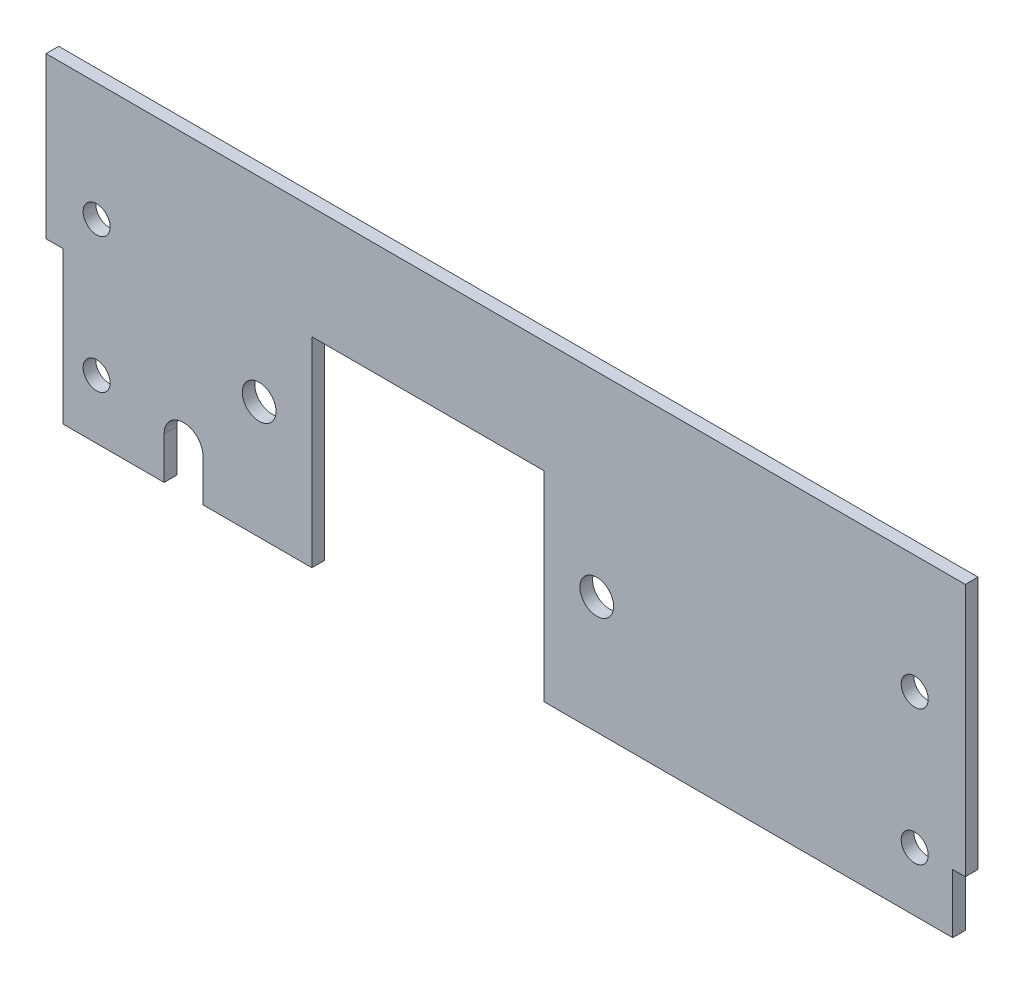
ISO-10303-21;
HEADER;
FILE_DESCRIPTION(('STEP AP214'),'2;1');
FILE_NAME('part.step','',(''),(''),'','','');
FILE_SCHEMA(('AUTOMOTIVE_DESIGN { 1 0 10303 214 1 1 1 1 }'));
ENDSEC;
DATA;
#1=APPLICATION_CONTEXT('core data for automotive mechanical design processes');
#2=APPLICATION_PROTOCOL_DEFINITION('international standard','automotive_design',2000,#1);
#3=PRODUCT_CONTEXT('',#1,'mechanical');
#4=PRODUCT('Part','Part','',(#3));
#5=PRODUCT_RELATED_PRODUCT_CATEGORY('part','',(#4));
#6=PRODUCT_DEFINITION_FORMATION('','',#4);
#7=PRODUCT_DEFINITION_CONTEXT('part definition',#1,'design');
#8=PRODUCT_DEFINITION('design','',#6,#7);
#9=PRODUCT_DEFINITION_SHAPE('','',#8);
#10=(LENGTH_UNIT() NAMED_UNIT(*) SI_UNIT(.MILLI.,.METRE.));
#11=(NAMED_UNIT(*) PLANE_ANGLE_UNIT() SI_UNIT($,.RADIAN.));
#12=(NAMED_UNIT(*) SI_UNIT($,.STERADIAN.) SOLID_ANGLE_UNIT());
#13=UNCERTAINTY_MEASURE_WITH_UNIT(LENGTH_MEASURE(1.E-05),#10,'distance_accuracy_value','');
#14=(GEOMETRIC_REPRESENTATION_CONTEXT(3) GLOBAL_UNCERTAINTY_ASSIGNED_CONTEXT((#13)) GLOBAL_UNIT_ASSIGNED_CONTEXT((#10,
#11,#12)) REPRESENTATION_CONTEXT('',''));
#15=CARTESIAN_POINT('',(0.,0.,0.));
#16=DIRECTION('',(0.,0.,1.));
#17=DIRECTION('',(1.,0.,0.));
#18=AXIS2_PLACEMENT_3D('',#15,#16,#17);
#19=CARTESIAN_POINT('',(110.91474286849,561.080871165908,1.5));
#20=DIRECTION('',(0.,1.,0.));
#21=DIRECTION('',(0.,0.,1.));
#22=AXIS2_PLACEMENT_3D('',#19,#20,#21);
#23=PLANE('',#22);
#24=DIRECTION('',(1.,0.,0.));
#25=VECTOR('',#24,1.);
#26=CARTESIAN_POINT('',(110.91474286849,561.080871165908,0.));
#27=LINE('',#26,#25);
#28=CARTESIAN_POINT('',(3.,561.080871165908,0.));
#29=VERTEX_POINT('',#28);
#30=CARTESIAN_POINT('',(15.,561.080871165908,0.));
#31=VERTEX_POINT('',#30);
#32=EDGE_CURVE('E197',#29,#31,#27,.T.);
#33=ORIENTED_EDGE('',*,*,#32,.T.);
#34=DIRECTION('',(0.,0.,1.));
#35=VECTOR('',#34,1.);
#36=CARTESIAN_POINT('',(15.,561.080871165908,1.5));
#37=LINE('',#36,#35);
#38=CARTESIAN_POINT('',(15.,561.080871165908,1.5));
#39=VERTEX_POINT('',#38);
#40=EDGE_CURVE('E163',#31,#39,#37,.T.);
#41=ORIENTED_EDGE('',*,*,#40,.T.);
#42=DIRECTION('',(1.,0.,0.));
#43=VECTOR('',#42,1.);
#44=CARTESIAN_POINT('',(110.91474286849,561.080871165908,1.5));
#45=LINE('',#44,#43);
#46=CARTESIAN_POINT('',(3.,561.080871165908,1.5));
#47=VERTEX_POINT('',#46);
#48=EDGE_CURVE('E180',#47,#39,#45,.T.);
#49=ORIENTED_EDGE('',*,*,#48,.F.);
#50=DIRECTION('',(0.,0.,1.));
#51=VECTOR('',#50,1.);
#52=CARTESIAN_POINT('',(3.,561.080871165908,0.));
#53=LINE('',#52,#51);
#54=EDGE_CURVE('E273',#29,#47,#53,.T.);
#55=ORIENTED_EDGE('',*,*,#54,.F.);
#56=EDGE_LOOP('',(#33,#41,#49,#55));
#57=FACE_BOUND('',#56,.T.);
#58=ADVANCED_FACE('F39',(#57),#23,.F.);
#59=CARTESIAN_POINT('',(19.6,561.080871165908,1.5));
#60=VERTEX_POINT('',#59);
#61=CARTESIAN_POINT('',(32.5,561.080871165908,1.5));
#62=VERTEX_POINT('',#61);
#63=EDGE_CURVE('E172',#60,#62,#45,.T.);
#64=ORIENTED_EDGE('',*,*,#63,.F.);
#65=DIRECTION('',(0.,0.,-1.));
#66=VECTOR('',#65,1.);
#67=CARTESIAN_POINT('',(19.6,561.080871165908,1.5));
#68=LINE('',#67,#66);
#69=CARTESIAN_POINT('',(19.6,561.080871165908,0.));
#70=VERTEX_POINT('',#69);
#71=EDGE_CURVE('E153',#60,#70,#68,.T.);
#72=ORIENTED_EDGE('',*,*,#71,.T.);
#73=CARTESIAN_POINT('',(32.5,561.080871165908,0.));
#74=VERTEX_POINT('',#73);
#75=EDGE_CURVE('E201',#70,#74,#27,.T.);
#76=ORIENTED_EDGE('',*,*,#75,.T.);
#77=DIRECTION('',(0.,0.,1.));
#78=VECTOR('',#77,1.);
#79=CARTESIAN_POINT('',(32.5,561.080871165908,1.5));
#80=LINE('',#79,#78);
#81=EDGE_CURVE('E164',#74,#62,#80,.T.);
#82=ORIENTED_EDGE('',*,*,#81,.T.);
#83=EDGE_LOOP('',(#64,#72,#76,#82));
#84=FACE_BOUND('',#83,.T.);
#85=ADVANCED_FACE('F178',(#84),#23,.F.);
#86=CARTESIAN_POINT('',(0.,0.,1.5));
#87=DIRECTION('',(0.,0.,1.));
#88=DIRECTION('',(1.,0.,0.));
#89=AXIS2_PLACEMENT_3D('',#86,#87,#88);
#90=PLANE('',#89);
#91=DIRECTION('',(0.,-1.,0.));
#92=VECTOR('',#91,1.);
#93=CARTESIAN_POINT('',(15.,561.080871165908,1.5));
#94=LINE('',#93,#92);
#95=CARTESIAN_POINT('',(15.,566.080871165908,1.5));
#96=VERTEX_POINT('',#95);
#97=EDGE_CURVE('E404',#96,#39,#94,.T.);
#98=ORIENTED_EDGE('',*,*,#97,.F.);
#99=CARTESIAN_POINT('',(17.3,566.080871165908,1.5));
#100=DIRECTION('',(0.,0.,1.));
#101=DIRECTION('',(1.,0.,0.));
#102=AXIS2_PLACEMENT_3D('',#99,#100,#101);
#103=CIRCLE('',#102,2.3);
#104=CARTESIAN_POINT('',(19.6,566.080871165908,1.5));
#105=VERTEX_POINT('',#104);
#106=EDGE_CURVE('E174',#105,#96,#103,.T.);
#107=ORIENTED_EDGE('',*,*,#106,.F.);
#108=DIRECTION('',(0.,1.,0.));
#109=VECTOR('',#108,1.);
#110=CARTESIAN_POINT('',(19.6,561.080871165908,1.5));
#111=LINE('',#110,#109);
#112=EDGE_CURVE('E156',#60,#105,#111,.T.);
#113=ORIENTED_EDGE('',*,*,#112,.F.);
#114=ORIENTED_EDGE('',*,*,#63,.T.);
#115=DIRECTION('',(0.,-1.,0.));
#116=VECTOR('',#115,1.);
#117=CARTESIAN_POINT('',(32.5,584.780871165908,1.5));
#118=LINE('',#117,#116);
#119=CARTESIAN_POINT('',(32.5,584.780871165908,1.5));
#120=VERTEX_POINT('',#119);
#121=EDGE_CURVE('E426',#120,#62,#118,.T.);
#122=ORIENTED_EDGE('',*,*,#121,.F.);
#123=DIRECTION('',(-1.,0.,0.));
#124=VECTOR('',#123,1.);
#125=CARTESIAN_POINT('',(32.5,584.780871165908,1.5));
#126=LINE('',#125,#124);
#127=CARTESIAN_POINT('',(60.,584.780871165908,1.5));
#128=VERTEX_POINT('',#127);
#129=EDGE_CURVE('E418',#128,#120,#126,.T.);
#130=ORIENTED_EDGE('',*,*,#129,.F.);
#131=DIRECTION('',(0.,1.,0.));
#132=VECTOR('',#131,1.);
#133=CARTESIAN_POINT('',(60.,584.780871165908,1.5));
#134=LINE('',#133,#132);
#135=CARTESIAN_POINT('',(60.,561.080871165908,1.5));
#136=VERTEX_POINT('',#135);
#137=EDGE_CURVE('E359',#136,#128,#134,.T.);
#138=ORIENTED_EDGE('',*,*,#137,.F.);
#139=CARTESIAN_POINT('',(108.41474286849,561.080871165908,1.5));
#140=VERTEX_POINT('',#139);
#141=EDGE_CURVE('E181',#136,#140,#45,.T.);
#142=ORIENTED_EDGE('',*,*,#141,.T.);
#143=DIRECTION('',(0.,1.,0.));
#144=VECTOR('',#143,1.);
#145=CARTESIAN_POINT('',(108.41474286849,0.,1.5));
#146=LINE('',#145,#144);
#147=CARTESIAN_POINT('',(108.41474286849,568.080871165908,1.5));
#148=VERTEX_POINT('',#147);
#149=EDGE_CURVE('E246',#140,#148,#146,.T.);
#150=ORIENTED_EDGE('',*,*,#149,.T.);
#151=DIRECTION('',(-1.,0.,0.));
#152=VECTOR('',#151,1.);
#153=CARTESIAN_POINT('',(0.,568.080871165908,1.5));
#154=LINE('',#153,#152);
#155=CARTESIAN_POINT('',(109.91474286849,568.080871165908,1.5));
#156=VERTEX_POINT('',#155);
#157=EDGE_CURVE('E370',#156,#148,#154,.T.);
#158=ORIENTED_EDGE('',*,*,#157,.F.);
#159=DIRECTION('',(0.,-1.,0.));
#160=VECTOR('',#159,1.);
#161=CARTESIAN_POINT('',(109.91474286849,0.,1.5));
#162=LINE('',#161,#160);
#163=CARTESIAN_POINT('',(109.91474286849,598.080871165908,1.5));
#164=VERTEX_POINT('',#163);
#165=EDGE_CURVE('E366',#164,#156,#162,.T.);
#166=ORIENTED_EDGE('',*,*,#165,.F.);
#167=DIRECTION('',(-1.,0.,0.));
#168=VECTOR('',#167,1.);
#169=CARTESIAN_POINT('',(110.91474286849,598.080871165908,1.5));
#170=LINE('',#169,#168);
#171=CARTESIAN_POINT('',(1.,598.080871165908,1.5));
#172=VERTEX_POINT('',#171);
#173=EDGE_CURVE('E187',#164,#172,#170,.T.);
#174=ORIENTED_EDGE('',*,*,#173,.T.);
#175=DIRECTION('',(0.,-1.,0.));
#176=VECTOR('',#175,1.);
#177=CARTESIAN_POINT('',(1.00000000000007,0.,1.5));
#178=LINE('',#177,#176);
#179=CARTESIAN_POINT('',(1.,579.080871165908,1.5));
#180=VERTEX_POINT('',#179);
#181=EDGE_CURVE('E234',#172,#180,#178,.T.);
#182=ORIENTED_EDGE('',*,*,#181,.T.);
#183=DIRECTION('',(-1.,0.,0.));
#184=VECTOR('',#183,1.);
#185=CARTESIAN_POINT('',(0.,579.080871165908,1.5));
#186=LINE('',#185,#184);
#187=CARTESIAN_POINT('',(3.,579.080871165908,1.5));
#188=VERTEX_POINT('',#187);
#189=EDGE_CURVE('E269',#188,#180,#186,.T.);
#190=ORIENTED_EDGE('',*,*,#189,.F.);
#191=DIRECTION('',(0.,1.,0.));
#192=VECTOR('',#191,1.);
#193=CARTESIAN_POINT('',(3.,561.080871165908,1.5));
#194=LINE('',#193,#192);
#195=EDGE_CURVE('E263',#47,#188,#194,.T.);
#196=ORIENTED_EDGE('',*,*,#195,.F.);
#197=ORIENTED_EDGE('',*,*,#48,.T.);
#198=EDGE_LOOP('',(#98,#107,#113,#114,#122,#130,#138,#142,#150,#158,#166,#174,#182,#190,#196,#197));
#199=FACE_BOUND('',#198,.T.);
#200=CARTESIAN_POINT('',(26.25,574.980871165908,1.5));
#201=DIRECTION('',(0.,0.,1.));
#202=DIRECTION('',(1.,0.,0.));
#203=AXIS2_PLACEMENT_3D('',#200,#201,#202);
#204=CIRCLE('',#203,2.);
#205=CARTESIAN_POINT('',(28.25,574.980871165908,1.5));
#206=VERTEX_POINT('',#205);
#207=EDGE_CURVE('E436',#206,#206,#204,.T.);
#208=ORIENTED_EDGE('',*,*,#207,.F.);
#209=EDGE_LOOP('',(#208));
#210=FACE_BOUND('',#209,.T.);
#211=CARTESIAN_POINT('',(66.25,574.980871165908,1.5));
#212=DIRECTION('',(0.,0.,1.));
#213=DIRECTION('',(1.,0.,0.));
#214=AXIS2_PLACEMENT_3D('',#211,#212,#213);
#215=CIRCLE('',#214,2.);
#216=CARTESIAN_POINT('',(68.25,574.980871165908,1.5));
#217=VERTEX_POINT('',#216);
#218=EDGE_CURVE('E429',#217,#217,#215,.T.);
#219=ORIENTED_EDGE('',*,*,#218,.F.);
#220=EDGE_LOOP('',(#219));
#221=FACE_BOUND('',#220,.T.);
#222=CARTESIAN_POINT('',(7.,584.080871165908,1.5));
#223=DIRECTION('',(0.,0.,1.));
#224=DIRECTION('',(1.,0.,0.));
#225=AXIS2_PLACEMENT_3D('',#222,#223,#224);
#226=CIRCLE('',#225,1.60000000000006);
#227=CARTESIAN_POINT('',(8.60000000000005,584.080871165908,1.5));
#228=VERTEX_POINT('',#227);
#229=EDGE_CURVE('E293',#228,#228,#226,.T.);
#230=ORIENTED_EDGE('',*,*,#229,.F.);
#231=EDGE_LOOP('',(#230));
#232=FACE_BOUND('',#231,.T.);
#233=CARTESIAN_POINT('',(103.91474286849,584.080871165908,1.5));
#234=DIRECTION('',(0.,0.,1.));
#235=DIRECTION('',(1.,0.,0.));
#236=AXIS2_PLACEMENT_3D('',#233,#234,#235);
#237=CIRCLE('',#236,1.60000000000008);
#238=CARTESIAN_POINT('',(105.51474286849,584.080871165908,1.5));
#239=VERTEX_POINT('',#238);
#240=EDGE_CURVE('E196',#239,#239,#237,.T.);
#241=ORIENTED_EDGE('',*,*,#240,.F.);
#242=EDGE_LOOP('',(#241));
#243=FACE_BOUND('',#242,.T.);
#244=CARTESIAN_POINT('',(103.91474286849,568.080871165908,1.5));
#245=DIRECTION('',(0.,0.,1.));
#246=DIRECTION('',(1.,0.,0.));
#247=AXIS2_PLACEMENT_3D('',#244,#245,#246);
#248=CIRCLE('',#247,1.60000000000008);
#249=CARTESIAN_POINT('',(105.51474286849,568.080871165908,1.5));
#250=VERTEX_POINT('',#249);
#251=EDGE_CURVE('E301',#250,#250,#248,.T.);
#252=ORIENTED_EDGE('',*,*,#251,.F.);
#253=EDGE_LOOP('',(#252));
#254=FACE_BOUND('',#253,.T.);
#255=CARTESIAN_POINT('',(7.,568.080871165908,1.5));
#256=DIRECTION('',(0.,0.,1.));
#257=DIRECTION('',(1.,0.,0.));
#258=AXIS2_PLACEMENT_3D('',#255,#256,#257);
#259=CIRCLE('',#258,1.60000000000006);
#260=CARTESIAN_POINT('',(8.60000000000005,568.080871165908,1.5));
#261=VERTEX_POINT('',#260);
#262=EDGE_CURVE('E285',#261,#261,#259,.T.);
#263=ORIENTED_EDGE('',*,*,#262,.F.);
#264=EDGE_LOOP('',(#263));
#265=FACE_BOUND('',#264,.T.);
#266=ADVANCED_FACE('F169',(#199,#210,#221,#232,#243,#254,#265),#90,.T.);
#267=CARTESIAN_POINT('',(0.,0.,0.));
#268=DIRECTION('',(0.,0.,1.));
#269=DIRECTION('',(1.,0.,0.));
#270=AXIS2_PLACEMENT_3D('',#267,#268,#269);
#271=PLANE('',#270);
#272=CARTESIAN_POINT('',(26.25,574.980871165908,0.));
#273=DIRECTION('',(0.,0.,1.));
#274=DIRECTION('',(1.,0.,0.));
#275=AXIS2_PLACEMENT_3D('',#272,#273,#274);
#276=CIRCLE('',#275,2.);
#277=CARTESIAN_POINT('',(28.25,574.980871165908,0.));
#278=VERTEX_POINT('',#277);
#279=EDGE_CURVE('E230',#278,#278,#276,.T.);
#280=ORIENTED_EDGE('',*,*,#279,.T.);
#281=EDGE_LOOP('',(#280));
#282=FACE_BOUND('',#281,.T.);
#283=CARTESIAN_POINT('',(66.25,574.980871165908,0.));
#284=DIRECTION('',(0.,0.,1.));
#285=DIRECTION('',(1.,0.,0.));
#286=AXIS2_PLACEMENT_3D('',#283,#284,#285);
#287=CIRCLE('',#286,2.);
#288=CARTESIAN_POINT('',(68.25,574.980871165908,0.));
#289=VERTEX_POINT('',#288);
#290=EDGE_CURVE('E227',#289,#289,#287,.T.);
#291=ORIENTED_EDGE('',*,*,#290,.T.);
#292=EDGE_LOOP('',(#291));
#293=FACE_BOUND('',#292,.T.);
#294=CARTESIAN_POINT('',(103.91474286849,584.080871165908,0.));
#295=DIRECTION('',(0.,0.,1.));
#296=DIRECTION('',(1.,0.,0.));
#297=AXIS2_PLACEMENT_3D('',#294,#295,#296);
#298=CIRCLE('',#297,1.60000000000008);
#299=CARTESIAN_POINT('',(105.51474286849,584.080871165908,0.));
#300=VERTEX_POINT('',#299);
#301=EDGE_CURVE('E305',#300,#300,#298,.T.);
#302=ORIENTED_EDGE('',*,*,#301,.T.);
#303=EDGE_LOOP('',(#302));
#304=FACE_BOUND('',#303,.T.);
#305=CARTESIAN_POINT('',(103.91474286849,568.080871165908,0.));
#306=DIRECTION('',(0.,0.,1.));
#307=DIRECTION('',(1.,0.,0.));
#308=AXIS2_PLACEMENT_3D('',#305,#306,#307);
#309=CIRCLE('',#308,1.60000000000008);
#310=CARTESIAN_POINT('',(105.51474286849,568.080871165908,0.));
#311=VERTEX_POINT('',#310);
#312=EDGE_CURVE('E297',#311,#311,#309,.T.);
#313=ORIENTED_EDGE('',*,*,#312,.T.);
#314=EDGE_LOOP('',(#313));
#315=FACE_BOUND('',#314,.T.);
#316=CARTESIAN_POINT('',(7.,584.080871165908,0.));
#317=DIRECTION('',(0.,0.,1.));
#318=DIRECTION('',(1.,0.,0.));
#319=AXIS2_PLACEMENT_3D('',#316,#317,#318);
#320=CIRCLE('',#319,1.60000000000006);
#321=CARTESIAN_POINT('',(8.60000000000005,584.080871165908,0.));
#322=VERTEX_POINT('',#321);
#323=EDGE_CURVE('E289',#322,#322,#320,.T.);
#324=ORIENTED_EDGE('',*,*,#323,.T.);
#325=EDGE_LOOP('',(#324));
#326=FACE_BOUND('',#325,.T.);
#327=CARTESIAN_POINT('',(7.,568.080871165908,0.));
#328=DIRECTION('',(0.,0.,1.));
#329=DIRECTION('',(1.,0.,0.));
#330=AXIS2_PLACEMENT_3D('',#327,#328,#329);
#331=CIRCLE('',#330,1.60000000000006);
#332=CARTESIAN_POINT('',(8.60000000000005,568.080871165908,0.));
#333=VERTEX_POINT('',#332);
#334=EDGE_CURVE('E282',#333,#333,#331,.T.);
#335=ORIENTED_EDGE('',*,*,#334,.T.);
#336=EDGE_LOOP('',(#335));
#337=FACE_BOUND('',#336,.T.);
#338=CARTESIAN_POINT('',(17.3,566.080871165908,0.));
#339=DIRECTION('',(0.,0.,1.));
#340=DIRECTION('',(1.,0.,0.));
#341=AXIS2_PLACEMENT_3D('',#338,#339,#340);
#342=CIRCLE('',#341,2.3);
#343=CARTESIAN_POINT('',(19.6,566.080871165908,0.));
#344=VERTEX_POINT('',#343);
#345=CARTESIAN_POINT('',(15.,566.080871165908,0.));
#346=VERTEX_POINT('',#345);
#347=EDGE_CURVE('E11',#344,#346,#342,.T.);
#348=ORIENTED_EDGE('',*,*,#347,.T.);
#349=DIRECTION('',(0.,-1.,0.));
#350=VECTOR('',#349,1.);
#351=CARTESIAN_POINT('',(15.,0.,0.));
#352=LINE('',#351,#350);
#353=EDGE_CURVE('E231',#346,#31,#352,.T.);
#354=ORIENTED_EDGE('',*,*,#353,.T.);
#355=ORIENTED_EDGE('',*,*,#32,.F.);
#356=DIRECTION('',(0.,1.,0.));
#357=VECTOR('',#356,1.);
#358=CARTESIAN_POINT('',(3.,561.080871165908,0.));
#359=LINE('',#358,#357);
#360=CARTESIAN_POINT('',(3.,579.080871165908,0.));
#361=VERTEX_POINT('',#360);
#362=EDGE_CURVE('E264',#29,#361,#359,.T.);
#363=ORIENTED_EDGE('',*,*,#362,.T.);
#364=DIRECTION('',(-1.,0.,0.));
#365=VECTOR('',#364,1.);
#366=CARTESIAN_POINT('',(0.,579.080871165908,0.));
#367=LINE('',#366,#365);
#368=CARTESIAN_POINT('',(1.,579.080871165908,0.));
#369=VERTEX_POINT('',#368);
#370=EDGE_CURVE('E268',#361,#369,#367,.T.);
#371=ORIENTED_EDGE('',*,*,#370,.T.);
#372=DIRECTION('',(0.,-1.,0.));
#373=VECTOR('',#372,1.);
#374=CARTESIAN_POINT('',(1.00000000000007,0.,0.));
#375=LINE('',#374,#373);
#376=CARTESIAN_POINT('',(1.,598.080871165908,0.));
#377=VERTEX_POINT('',#376);
#378=EDGE_CURVE('E252',#377,#369,#375,.T.);
#379=ORIENTED_EDGE('',*,*,#378,.F.);
#380=DIRECTION('',(-1.,0.,0.));
#381=VECTOR('',#380,1.);
#382=CARTESIAN_POINT('',(110.91474286849,598.080871165908,0.));
#383=LINE('',#382,#381);
#384=CARTESIAN_POINT('',(109.91474286849,598.080871165908,0.));
#385=VERTEX_POINT('',#384);
#386=EDGE_CURVE('E191',#385,#377,#383,.T.);
#387=ORIENTED_EDGE('',*,*,#386,.F.);
#388=DIRECTION('',(0.,-1.,0.));
#389=VECTOR('',#388,1.);
#390=CARTESIAN_POINT('',(109.91474286849,0.,0.));
#391=LINE('',#390,#389);
#392=CARTESIAN_POINT('',(109.91474286849,568.080871165908,0.));
#393=VERTEX_POINT('',#392);
#394=EDGE_CURVE('E259',#385,#393,#391,.T.);
#395=ORIENTED_EDGE('',*,*,#394,.T.);
#396=DIRECTION('',(-1.,0.,0.));
#397=VECTOR('',#396,1.);
#398=CARTESIAN_POINT('',(0.,568.080871165908,0.));
#399=LINE('',#398,#397);
#400=CARTESIAN_POINT('',(108.41474286849,568.080871165908,0.));
#401=VERTEX_POINT('',#400);
#402=EDGE_CURVE('E212',#393,#401,#399,.T.);
#403=ORIENTED_EDGE('',*,*,#402,.T.);
#404=DIRECTION('',(0.,1.,0.));
#405=VECTOR('',#404,1.);
#406=CARTESIAN_POINT('',(108.41474286849,0.,0.));
#407=LINE('',#406,#405);
#408=CARTESIAN_POINT('',(108.41474286849,561.080871165908,0.));
#409=VERTEX_POINT('',#408);
#410=EDGE_CURVE('E255',#409,#401,#407,.T.);
#411=ORIENTED_EDGE('',*,*,#410,.F.);
#412=CARTESIAN_POINT('',(60.,561.080871165908,0.));
#413=VERTEX_POINT('',#412);
#414=EDGE_CURVE('E195',#413,#409,#27,.T.);
#415=ORIENTED_EDGE('',*,*,#414,.F.);
#416=DIRECTION('',(0.,1.,0.));
#417=VECTOR('',#416,1.);
#418=CARTESIAN_POINT('',(60.,0.,0.));
#419=LINE('',#418,#417);
#420=CARTESIAN_POINT('',(60.,584.780871165908,0.));
#421=VERTEX_POINT('',#420);
#422=EDGE_CURVE('E55',#413,#421,#419,.T.);
#423=ORIENTED_EDGE('',*,*,#422,.T.);
#424=DIRECTION('',(-1.,0.,0.));
#425=VECTOR('',#424,1.);
#426=CARTESIAN_POINT('',(0.,584.780871165908,0.));
#427=LINE('',#426,#425);
#428=CARTESIAN_POINT('',(32.5,584.780871165908,0.));
#429=VERTEX_POINT('',#428);
#430=EDGE_CURVE('E48',#421,#429,#427,.T.);
#431=ORIENTED_EDGE('',*,*,#430,.T.);
#432=DIRECTION('',(0.,-1.,0.));
#433=VECTOR('',#432,1.);
#434=CARTESIAN_POINT('',(32.5,0.,0.));
#435=LINE('',#434,#433);
#436=EDGE_CURVE('E407',#429,#74,#435,.T.);
#437=ORIENTED_EDGE('',*,*,#436,.T.);
#438=ORIENTED_EDGE('',*,*,#75,.F.);
#439=DIRECTION('',(0.,1.,0.));
#440=VECTOR('',#439,1.);
#441=CARTESIAN_POINT('',(19.6,0.,0.));
#442=LINE('',#441,#440);
#443=EDGE_CURVE('E63',#70,#344,#442,.T.);
#444=ORIENTED_EDGE('',*,*,#443,.T.);
#445=EDGE_LOOP('',(#348,#354,#355,#363,#371,#379,#387,#395,#403,#411,#415,#423,#431,#437,#438,#444));
#446=FACE_BOUND('',#445,.T.);
#447=ADVANCED_FACE('F315',(#282,#293,#304,#315,#326,#337,#446),#271,.F.);
#448=CARTESIAN_POINT('',(110.91474286849,598.080871165908,1.5));
#449=DIRECTION('',(0.,-1.,0.));
#450=DIRECTION('',(0.,0.,-1.));
#451=AXIS2_PLACEMENT_3D('',#448,#449,#450);
#452=PLANE('',#451);
#453=ORIENTED_EDGE('',*,*,#173,.F.);
#454=DIRECTION('',(0.,0.,-1.));
#455=VECTOR('',#454,1.);
#456=CARTESIAN_POINT('',(109.91474286849,598.080871165908,1.5));
#457=LINE('',#456,#455);
#458=EDGE_CURVE('E208',#164,#385,#457,.T.);
#459=ORIENTED_EDGE('',*,*,#458,.T.);
#460=ORIENTED_EDGE('',*,*,#386,.T.);
#461=DIRECTION('',(0.,0.,1.));
#462=VECTOR('',#461,1.);
#463=CARTESIAN_POINT('',(1.,598.080871165908,-8.5));
#464=LINE('',#463,#462);
#465=EDGE_CURVE('E239',#377,#172,#464,.T.);
#466=ORIENTED_EDGE('',*,*,#465,.T.);
#467=EDGE_LOOP('',(#453,#459,#460,#466));
#468=FACE_BOUND('',#467,.T.);
#469=ADVANCED_FACE('F41',(#468),#452,.F.);
#470=ORIENTED_EDGE('',*,*,#141,.F.);
#471=DIRECTION('',(0.,0.,-1.));
#472=VECTOR('',#471,1.);
#473=CARTESIAN_POINT('',(60.,561.080871165908,1.5));
#474=LINE('',#473,#472);
#475=EDGE_CURVE('E216',#136,#413,#474,.T.);
#476=ORIENTED_EDGE('',*,*,#475,.T.);
#477=ORIENTED_EDGE('',*,*,#414,.T.);
#478=DIRECTION('',(0.,0.,-1.));
#479=VECTOR('',#478,1.);
#480=CARTESIAN_POINT('',(108.41474286849,561.080871165908,1.5));
#481=LINE('',#480,#479);
#482=EDGE_CURVE('E204',#140,#409,#481,.T.);
#483=ORIENTED_EDGE('',*,*,#482,.F.);
#484=EDGE_LOOP('',(#470,#476,#477,#483));
#485=FACE_BOUND('',#484,.T.);
#486=ADVANCED_FACE('F331',(#485),#23,.F.);
#487=CARTESIAN_POINT('',(0.,579.080871165908,0.));
#488=DIRECTION('',(0.,1.,0.));
#489=DIRECTION('',(0.,0.,1.));
#490=AXIS2_PLACEMENT_3D('',#487,#488,#489);
#491=PLANE('',#490);
#492=DIRECTION('',(0.,0.,1.));
#493=VECTOR('',#492,1.);
#494=CARTESIAN_POINT('',(1.,579.080871165908,0.));
#495=LINE('',#494,#493);
#496=EDGE_CURVE('E186',#369,#180,#495,.T.);
#497=ORIENTED_EDGE('',*,*,#496,.F.);
#498=ORIENTED_EDGE('',*,*,#370,.F.);
#499=DIRECTION('',(0.,0.,1.));
#500=VECTOR('',#499,1.);
#501=CARTESIAN_POINT('',(3.,579.080871165908,0.));
#502=LINE('',#501,#500);
#503=EDGE_CURVE('E279',#361,#188,#502,.T.);
#504=ORIENTED_EDGE('',*,*,#503,.T.);
#505=ORIENTED_EDGE('',*,*,#189,.T.);
#506=EDGE_LOOP('',(#497,#498,#504,#505));
#507=FACE_BOUND('',#506,.T.);
#508=ADVANCED_FACE('F321',(#507),#491,.F.);
#509=CARTESIAN_POINT('',(103.91474286849,584.080871165908,1.5));
#510=DIRECTION('',(0.,0.,-1.));
#511=DIRECTION('',(-1.,0.,0.));
#512=AXIS2_PLACEMENT_3D('',#509,#510,#511);
#513=CYLINDRICAL_SURFACE('',#512,1.60000000000008);
#514=ORIENTED_EDGE('',*,*,#240,.T.);
#515=EDGE_LOOP('',(#514));
#516=FACE_BOUND('',#515,.T.);
#517=ORIENTED_EDGE('',*,*,#301,.F.);
#518=EDGE_LOOP('',(#517));
#519=FACE_BOUND('',#518,.T.);
#520=ADVANCED_FACE('F318',(#516,#519),#513,.F.);
#521=CARTESIAN_POINT('',(103.91474286849,568.080871165908,1.5));
#522=DIRECTION('',(0.,0.,-1.));
#523=DIRECTION('',(-1.,0.,0.));
#524=AXIS2_PLACEMENT_3D('',#521,#522,#523);
#525=CYLINDRICAL_SURFACE('',#524,1.60000000000008);
#526=ORIENTED_EDGE('',*,*,#251,.T.);
#527=EDGE_LOOP('',(#526));
#528=FACE_BOUND('',#527,.T.);
#529=ORIENTED_EDGE('',*,*,#312,.F.);
#530=EDGE_LOOP('',(#529));
#531=FACE_BOUND('',#530,.T.);
#532=ADVANCED_FACE('F320',(#528,#531),#525,.F.);
#533=CARTESIAN_POINT('',(7.,584.080871165908,1.5));
#534=DIRECTION('',(0.,0.,-1.));
#535=DIRECTION('',(-1.,0.,0.));
#536=AXIS2_PLACEMENT_3D('',#533,#534,#535);
#537=CYLINDRICAL_SURFACE('',#536,1.60000000000006);
#538=ORIENTED_EDGE('',*,*,#229,.T.);
#539=EDGE_LOOP('',(#538));
#540=FACE_BOUND('',#539,.T.);
#541=ORIENTED_EDGE('',*,*,#323,.F.);
#542=EDGE_LOOP('',(#541));
#543=FACE_BOUND('',#542,.T.);
#544=ADVANCED_FACE('F327',(#540,#543),#537,.F.);
#545=CARTESIAN_POINT('',(7.,568.080871165908,1.5));
#546=DIRECTION('',(0.,0.,-1.));
#547=DIRECTION('',(-1.,0.,0.));
#548=AXIS2_PLACEMENT_3D('',#545,#546,#547);
#549=CYLINDRICAL_SURFACE('',#548,1.60000000000006);
#550=ORIENTED_EDGE('',*,*,#262,.T.);
#551=EDGE_LOOP('',(#550));
#552=FACE_BOUND('',#551,.T.);
#553=ORIENTED_EDGE('',*,*,#334,.F.);
#554=EDGE_LOOP('',(#553));
#555=FACE_BOUND('',#554,.T.);
#556=ADVANCED_FACE('F461',(#552,#555),#549,.F.);
#557=CARTESIAN_POINT('',(3.,561.080871165908,0.));
#558=DIRECTION('',(1.,0.,0.));
#559=DIRECTION('',(0.,0.,-1.));
#560=AXIS2_PLACEMENT_3D('',#557,#558,#559);
#561=PLANE('',#560);
#562=ORIENTED_EDGE('',*,*,#195,.T.);
#563=ORIENTED_EDGE('',*,*,#503,.F.);
#564=ORIENTED_EDGE('',*,*,#362,.F.);
#565=ORIENTED_EDGE('',*,*,#54,.T.);
#566=EDGE_LOOP('',(#562,#563,#564,#565));
#567=FACE_BOUND('',#566,.T.);
#568=ADVANCED_FACE('F464',(#567),#561,.F.);
#569=CARTESIAN_POINT('',(1.00000000000007,0.,-8.5));
#570=DIRECTION('',(-1.,0.,0.));
#571=DIRECTION('',(0.,-1.,0.));
#572=AXIS2_PLACEMENT_3D('',#569,#570,#571);
#573=PLANE('',#572);
#574=ORIENTED_EDGE('',*,*,#378,.T.);
#575=ORIENTED_EDGE('',*,*,#496,.T.);
#576=ORIENTED_EDGE('',*,*,#181,.F.);
#577=ORIENTED_EDGE('',*,*,#465,.F.);
#578=EDGE_LOOP('',(#574,#575,#576,#577));
#579=FACE_BOUND('',#578,.T.);
#580=ADVANCED_FACE('F394',(#579),#573,.T.);
#581=CARTESIAN_POINT('',(0.,568.080871165908,-8.5));
#582=DIRECTION('',(0.,1.,0.));
#583=DIRECTION('',(0.,0.,1.));
#584=AXIS2_PLACEMENT_3D('',#581,#582,#583);
#585=PLANE('',#584);
#586=DIRECTION('',(0.,0.,1.));
#587=VECTOR('',#586,1.);
#588=CARTESIAN_POINT('',(109.91474286849,568.080871165908,-8.5));
#589=LINE('',#588,#587);
#590=EDGE_CURVE('E249',#393,#156,#589,.T.);
#591=ORIENTED_EDGE('',*,*,#590,.T.);
#592=ORIENTED_EDGE('',*,*,#157,.T.);
#593=DIRECTION('',(0.,0.,1.));
#594=VECTOR('',#593,1.);
#595=CARTESIAN_POINT('',(108.41474286849,568.080871165908,-8.5));
#596=LINE('',#595,#594);
#597=EDGE_CURVE('E256',#401,#148,#596,.T.);
#598=ORIENTED_EDGE('',*,*,#597,.F.);
#599=ORIENTED_EDGE('',*,*,#402,.F.);
#600=EDGE_LOOP('',(#591,#592,#598,#599));
#601=FACE_BOUND('',#600,.T.);
#602=ADVANCED_FACE('F380',(#601),#585,.F.);
#603=CARTESIAN_POINT('',(109.91474286849,0.,-8.5));
#604=DIRECTION('',(-1.,0.,0.));
#605=DIRECTION('',(0.,0.,1.));
#606=AXIS2_PLACEMENT_3D('',#603,#604,#605);
#607=PLANE('',#606);
#608=ORIENTED_EDGE('',*,*,#458,.F.);
#609=ORIENTED_EDGE('',*,*,#165,.T.);
#610=ORIENTED_EDGE('',*,*,#590,.F.);
#611=ORIENTED_EDGE('',*,*,#394,.F.);
#612=EDGE_LOOP('',(#608,#609,#610,#611));
#613=FACE_BOUND('',#612,.T.);
#614=ADVANCED_FACE('F383',(#613),#607,.F.);
#615=CARTESIAN_POINT('',(108.41474286849,0.,-8.5));
#616=DIRECTION('',(1.,0.,0.));
#617=DIRECTION('',(0.,0.,-1.));
#618=AXIS2_PLACEMENT_3D('',#615,#616,#617);
#619=PLANE('',#618);
#620=ORIENTED_EDGE('',*,*,#410,.T.);
#621=ORIENTED_EDGE('',*,*,#597,.T.);
#622=ORIENTED_EDGE('',*,*,#149,.F.);
#623=ORIENTED_EDGE('',*,*,#482,.T.);
#624=EDGE_LOOP('',(#620,#621,#622,#623));
#625=FACE_BOUND('',#624,.T.);
#626=ADVANCED_FACE('F361',(#625),#619,.T.);
#627=CARTESIAN_POINT('',(32.5,584.780871165908,-8.5));
#628=DIRECTION('',(0.,1.,0.));
#629=DIRECTION('',(0.,0.,1.));
#630=AXIS2_PLACEMENT_3D('',#627,#628,#629);
#631=PLANE('',#630);
#632=DIRECTION('',(0.,0.,1.));
#633=VECTOR('',#632,1.);
#634=CARTESIAN_POINT('',(60.,584.780871165908,-8.5));
#635=LINE('',#634,#633);
#636=EDGE_CURVE('E415',#421,#128,#635,.T.);
#637=ORIENTED_EDGE('',*,*,#636,.T.);
#638=ORIENTED_EDGE('',*,*,#129,.T.);
#639=DIRECTION('',(0.,0.,1.));
#640=VECTOR('',#639,1.);
#641=CARTESIAN_POINT('',(32.5,584.780871165908,-8.5));
#642=LINE('',#641,#640);
#643=EDGE_CURVE('E414',#429,#120,#642,.T.);
#644=ORIENTED_EDGE('',*,*,#643,.F.);
#645=ORIENTED_EDGE('',*,*,#430,.F.);
#646=EDGE_LOOP('',(#637,#638,#644,#645));
#647=FACE_BOUND('',#646,.T.);
#648=ADVANCED_FACE('F490',(#647),#631,.F.);
#649=CARTESIAN_POINT('',(32.5,584.780871165908,-8.5));
#650=DIRECTION('',(-1.,0.,0.));
#651=DIRECTION('',(0.,0.,1.));
#652=AXIS2_PLACEMENT_3D('',#649,#650,#651);
#653=PLANE('',#652);
#654=ORIENTED_EDGE('',*,*,#643,.T.);
#655=ORIENTED_EDGE('',*,*,#121,.T.);
#656=ORIENTED_EDGE('',*,*,#81,.F.);
#657=ORIENTED_EDGE('',*,*,#436,.F.);
#658=EDGE_LOOP('',(#654,#655,#656,#657));
#659=FACE_BOUND('',#658,.T.);
#660=ADVANCED_FACE('F493',(#659),#653,.F.);
#661=CARTESIAN_POINT('',(60.,584.780871165908,-8.5));
#662=DIRECTION('',(1.,0.,0.));
#663=DIRECTION('',(0.,0.,-1.));
#664=AXIS2_PLACEMENT_3D('',#661,#662,#663);
#665=PLANE('',#664);
#666=ORIENTED_EDGE('',*,*,#475,.F.);
#667=ORIENTED_EDGE('',*,*,#137,.T.);
#668=ORIENTED_EDGE('',*,*,#636,.F.);
#669=ORIENTED_EDGE('',*,*,#422,.F.);
#670=EDGE_LOOP('',(#666,#667,#668,#669));
#671=FACE_BOUND('',#670,.T.);
#672=ADVANCED_FACE('F487',(#671),#665,.F.);
#673=CARTESIAN_POINT('',(17.3,566.080871165908,-8.5));
#674=DIRECTION('',(0.,0.,1.));
#675=DIRECTION('',(1.,0.,0.));
#676=AXIS2_PLACEMENT_3D('',#673,#674,#675);
#677=CYLINDRICAL_SURFACE('',#676,2.3);
#678=DIRECTION('',(0.,0.,1.));
#679=VECTOR('',#678,1.);
#680=CARTESIAN_POINT('',(19.6,566.080871165908,-8.5));
#681=LINE('',#680,#679);
#682=EDGE_CURVE('E430',#344,#105,#681,.T.);
#683=ORIENTED_EDGE('',*,*,#682,.T.);
#684=ORIENTED_EDGE('',*,*,#106,.T.);
#685=DIRECTION('',(0.,0.,1.));
#686=VECTOR('',#685,1.);
#687=CARTESIAN_POINT('',(15.,566.080871165908,-8.5));
#688=LINE('',#687,#686);
#689=EDGE_CURVE('E433',#346,#96,#688,.T.);
#690=ORIENTED_EDGE('',*,*,#689,.F.);
#691=ORIENTED_EDGE('',*,*,#347,.F.);
#692=EDGE_LOOP('',(#683,#684,#690,#691));
#693=FACE_BOUND('',#692,.T.);
#694=ADVANCED_FACE('F485',(#693),#677,.F.);
#695=CARTESIAN_POINT('',(15.,561.080871165908,-8.5));
#696=DIRECTION('',(-1.,0.,0.));
#697=DIRECTION('',(0.,0.,1.));
#698=AXIS2_PLACEMENT_3D('',#695,#696,#697);
#699=PLANE('',#698);
#700=ORIENTED_EDGE('',*,*,#689,.T.);
#701=ORIENTED_EDGE('',*,*,#97,.T.);
#702=ORIENTED_EDGE('',*,*,#40,.F.);
#703=ORIENTED_EDGE('',*,*,#353,.F.);
#704=EDGE_LOOP('',(#700,#701,#702,#703));
#705=FACE_BOUND('',#704,.T.);
#706=ADVANCED_FACE('F402',(#705),#699,.F.);
#707=CARTESIAN_POINT('',(19.6,561.080871165908,-8.5));
#708=DIRECTION('',(1.,0.,0.));
#709=DIRECTION('',(0.,0.,-1.));
#710=AXIS2_PLACEMENT_3D('',#707,#708,#709);
#711=PLANE('',#710);
#712=ORIENTED_EDGE('',*,*,#71,.F.);
#713=ORIENTED_EDGE('',*,*,#112,.T.);
#714=ORIENTED_EDGE('',*,*,#682,.F.);
#715=ORIENTED_EDGE('',*,*,#443,.F.);
#716=EDGE_LOOP('',(#712,#713,#714,#715));
#717=FACE_BOUND('',#716,.T.);
#718=ADVANCED_FACE('F155',(#717),#711,.F.);
#719=CARTESIAN_POINT('',(66.25,574.980871165908,-8.5));
#720=DIRECTION('',(0.,0.,1.));
#721=DIRECTION('',(1.,0.,0.));
#722=AXIS2_PLACEMENT_3D('',#719,#720,#721);
#723=CYLINDRICAL_SURFACE('',#722,2.);
#724=ORIENTED_EDGE('',*,*,#218,.T.);
#725=EDGE_LOOP('',(#724));
#726=FACE_BOUND('',#725,.T.);
#727=ORIENTED_EDGE('',*,*,#290,.F.);
#728=EDGE_LOOP('',(#727));
#729=FACE_BOUND('',#728,.T.);
#730=ADVANCED_FACE('F448',(#726,#729),#723,.F.);
#731=CARTESIAN_POINT('',(26.25,574.980871165908,-8.5));
#732=DIRECTION('',(0.,0.,1.));
#733=DIRECTION('',(1.,0.,0.));
#734=AXIS2_PLACEMENT_3D('',#731,#732,#733);
#735=CYLINDRICAL_SURFACE('',#734,2.);
#736=ORIENTED_EDGE('',*,*,#207,.T.);
#737=EDGE_LOOP('',(#736));
#738=FACE_BOUND('',#737,.T.);
#739=ORIENTED_EDGE('',*,*,#279,.F.);
#740=EDGE_LOOP('',(#739));
#741=FACE_BOUND('',#740,.T.);
#742=ADVANCED_FACE('F473',(#738,#741),#735,.F.);
#743=CLOSED_SHELL('',(#58,#85,#266,#447,#469,#486,#508,#520,#532,#544,#556,#568,#580,#602,#614,
#626,#648,#660,#672,#694,#706,#718,#730,#742));
#744=MANIFOLD_SOLID_BREP('B2',#743);
#745=ADVANCED_BREP_SHAPE_REPRESENTATION('',(#18,#744),#14);
#746=SHAPE_DEFINITION_REPRESENTATION(#9,#745);
ENDSEC;
END-ISO-10303-21;
